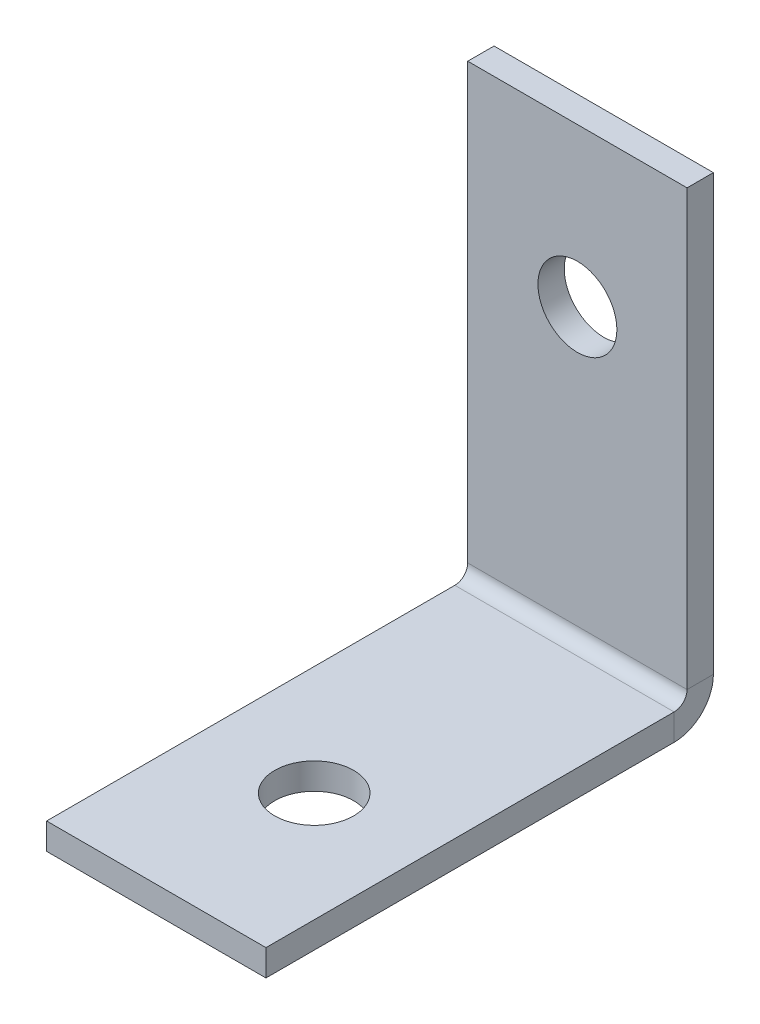
ISO-10303-21;
HEADER;
FILE_DESCRIPTION(('STEP AP214'),'2;1');
FILE_NAME('part.step','',(''),(''),'','','');
FILE_SCHEMA(('AUTOMOTIVE_DESIGN { 1 0 10303 214 1 1 1 1 }'));
ENDSEC;
DATA;
#1=APPLICATION_CONTEXT('core data for automotive mechanical design processes');
#2=APPLICATION_PROTOCOL_DEFINITION('international standard','automotive_design',2000,#1);
#3=PRODUCT_CONTEXT('',#1,'mechanical');
#4=PRODUCT('Part','Part','',(#3));
#5=PRODUCT_RELATED_PRODUCT_CATEGORY('part','',(#4));
#6=PRODUCT_DEFINITION_FORMATION('','',#4);
#7=PRODUCT_DEFINITION_CONTEXT('part definition',#1,'design');
#8=PRODUCT_DEFINITION('design','',#6,#7);
#9=PRODUCT_DEFINITION_SHAPE('','',#8);
#10=(LENGTH_UNIT() NAMED_UNIT(*) SI_UNIT(.MILLI.,.METRE.));
#11=(NAMED_UNIT(*) PLANE_ANGLE_UNIT() SI_UNIT($,.RADIAN.));
#12=(NAMED_UNIT(*) SI_UNIT($,.STERADIAN.) SOLID_ANGLE_UNIT());
#13=UNCERTAINTY_MEASURE_WITH_UNIT(LENGTH_MEASURE(1.E-05),#10,'distance_accuracy_value','');
#14=(GEOMETRIC_REPRESENTATION_CONTEXT(3) GLOBAL_UNCERTAINTY_ASSIGNED_CONTEXT((#13)) GLOBAL_UNIT_ASSIGNED_CONTEXT((#10,
#11,#12)) REPRESENTATION_CONTEXT('',''));
#15=CARTESIAN_POINT('',(0.,0.,0.));
#16=DIRECTION('',(0.,0.,1.));
#17=DIRECTION('',(1.,0.,0.));
#18=AXIS2_PLACEMENT_3D('',#15,#16,#17);
#19=CARTESIAN_POINT('',(6.25,1.5,-12.75));
#20=DIRECTION('',(-1.,0.,0.));
#21=DIRECTION('',(0.,0.,1.));
#22=AXIS2_PLACEMENT_3D('',#19,#20,#21);
#23=PLANE('',#22);
#24=DIRECTION('',(0.,-1.,0.));
#25=VECTOR('',#24,1.);
#26=CARTESIAN_POINT('',(6.25,1.49999999999999,-10.5134));
#27=LINE('',#26,#25);
#28=CARTESIAN_POINT('',(6.25,1.5,-10.5134));
#29=VERTEX_POINT('',#28);
#30=CARTESIAN_POINT('',(6.25,0.,-10.5134));
#31=VERTEX_POINT('',#30);
#32=EDGE_CURVE('E76',#29,#31,#27,.T.);
#33=ORIENTED_EDGE('',*,*,#32,.F.);
#34=DIRECTION('',(0.,0.,-1.));
#35=VECTOR('',#34,1.);
#36=CARTESIAN_POINT('',(6.25,1.5,-12.75));
#37=LINE('',#36,#35);
#38=CARTESIAN_POINT('',(6.25,1.5,12.75));
#39=VERTEX_POINT('',#38);
#40=EDGE_CURVE('E181',#39,#29,#37,.T.);
#41=ORIENTED_EDGE('',*,*,#40,.F.);
#42=DIRECTION('',(0.,-1.,0.));
#43=VECTOR('',#42,1.);
#44=CARTESIAN_POINT('',(6.25,1.5,12.75));
#45=LINE('',#44,#43);
#46=CARTESIAN_POINT('',(6.25,0.,12.75));
#47=VERTEX_POINT('',#46);
#48=EDGE_CURVE('E61',#39,#47,#45,.T.);
#49=ORIENTED_EDGE('',*,*,#48,.T.);
#50=DIRECTION('',(0.,0.,-1.));
#51=VECTOR('',#50,1.);
#52=CARTESIAN_POINT('',(6.25,0.,-12.75));
#53=LINE('',#52,#51);
#54=EDGE_CURVE('E179',#47,#31,#53,.T.);
#55=ORIENTED_EDGE('',*,*,#54,.T.);
#56=EDGE_LOOP('',(#33,#41,#49,#55));
#57=FACE_BOUND('',#56,.T.);
#58=ADVANCED_FACE('F53',(#57),#23,.F.);
#59=CARTESIAN_POINT('',(-6.25,1.5,-12.75));
#60=DIRECTION('',(1.,0.,0.));
#61=DIRECTION('',(0.,0.,-1.));
#62=AXIS2_PLACEMENT_3D('',#59,#60,#61);
#63=PLANE('',#62);
#64=DIRECTION('',(0.,-1.,0.));
#65=VECTOR('',#64,1.);
#66=CARTESIAN_POINT('',(-6.25,1.49999999999999,-10.5134));
#67=LINE('',#66,#65);
#68=CARTESIAN_POINT('',(-6.25,1.5,-10.5134));
#69=VERTEX_POINT('',#68);
#70=CARTESIAN_POINT('',(-6.25,0.,-10.5134));
#71=VERTEX_POINT('',#70);
#72=EDGE_CURVE('E168',#69,#71,#67,.T.);
#73=ORIENTED_EDGE('',*,*,#72,.T.);
#74=DIRECTION('',(0.,0.,1.));
#75=VECTOR('',#74,1.);
#76=CARTESIAN_POINT('',(-6.25,0.,-12.75));
#77=LINE('',#76,#75);
#78=CARTESIAN_POINT('',(-6.25,0.,12.75));
#79=VERTEX_POINT('',#78);
#80=EDGE_CURVE('E189',#71,#79,#77,.T.);
#81=ORIENTED_EDGE('',*,*,#80,.T.);
#82=DIRECTION('',(0.,-1.,0.));
#83=VECTOR('',#82,1.);
#84=CARTESIAN_POINT('',(-6.25,1.5,12.75));
#85=LINE('',#84,#83);
#86=CARTESIAN_POINT('',(-6.25,1.5,12.75));
#87=VERTEX_POINT('',#86);
#88=EDGE_CURVE('E13',#87,#79,#85,.T.);
#89=ORIENTED_EDGE('',*,*,#88,.F.);
#90=DIRECTION('',(0.,0.,1.));
#91=VECTOR('',#90,1.);
#92=CARTESIAN_POINT('',(-6.25,1.5,-12.75));
#93=LINE('',#92,#91);
#94=EDGE_CURVE('E183',#69,#87,#93,.T.);
#95=ORIENTED_EDGE('',*,*,#94,.F.);
#96=EDGE_LOOP('',(#73,#81,#89,#95));
#97=FACE_BOUND('',#96,.T.);
#98=ADVANCED_FACE('F250',(#97),#63,.F.);
#99=CARTESIAN_POINT('',(6.25,1.5,12.75));
#100=DIRECTION('',(0.,1.,0.));
#101=DIRECTION('',(0.,0.,1.));
#102=AXIS2_PLACEMENT_3D('',#99,#100,#101);
#103=PLANE('',#102);
#104=CARTESIAN_POINT('',(0.,1.5,3.75));
#105=DIRECTION('',(0.,1.,0.));
#106=DIRECTION('',(0.,0.,1.));
#107=AXIS2_PLACEMENT_3D('',#104,#105,#106);
#108=CIRCLE('',#107,2.25);
#109=CARTESIAN_POINT('',(0.,1.5,6.));
#110=VERTEX_POINT('',#109);
#111=EDGE_CURVE('E214',#110,#110,#108,.T.);
#112=ORIENTED_EDGE('',*,*,#111,.F.);
#113=EDGE_LOOP('',(#112));
#114=FACE_BOUND('',#113,.T.);
#115=ORIENTED_EDGE('',*,*,#40,.T.);
#116=DIRECTION('',(-1.,0.,0.));
#117=VECTOR('',#116,1.);
#118=CARTESIAN_POINT('',(-6.25,1.49999999999999,-10.5134));
#119=LINE('',#118,#117);
#120=EDGE_CURVE('E68',#69,#29,#119,.F.);
#121=ORIENTED_EDGE('',*,*,#120,.F.);
#122=ORIENTED_EDGE('',*,*,#94,.T.);
#123=DIRECTION('',(1.,0.,0.));
#124=VECTOR('',#123,1.);
#125=CARTESIAN_POINT('',(-6.25,1.5,12.75));
#126=LINE('',#125,#124);
#127=EDGE_CURVE('E186',#87,#39,#126,.T.);
#128=ORIENTED_EDGE('',*,*,#127,.T.);
#129=EDGE_LOOP('',(#115,#121,#122,#128));
#130=FACE_BOUND('',#129,.T.);
#131=ADVANCED_FACE('F254',(#114,#130),#103,.T.);
#132=CARTESIAN_POINT('',(6.25,0.,12.75));
#133=DIRECTION('',(0.,1.,0.));
#134=DIRECTION('',(0.,0.,1.));
#135=AXIS2_PLACEMENT_3D('',#132,#133,#134);
#136=PLANE('',#135);
#137=CARTESIAN_POINT('',(0.,0.,3.75));
#138=DIRECTION('',(0.,1.,0.));
#139=DIRECTION('',(0.,0.,1.));
#140=AXIS2_PLACEMENT_3D('',#137,#138,#139);
#141=CIRCLE('',#140,2.25);
#142=CARTESIAN_POINT('',(0.,0.,6.));
#143=VERTEX_POINT('',#142);
#144=EDGE_CURVE('E56',#143,#143,#141,.T.);
#145=ORIENTED_EDGE('',*,*,#144,.T.);
#146=EDGE_LOOP('',(#145));
#147=FACE_BOUND('',#146,.T.);
#148=DIRECTION('',(-1.,0.,0.));
#149=VECTOR('',#148,1.);
#150=CARTESIAN_POINT('',(-6.25,0.,-10.5134));
#151=LINE('',#150,#149);
#152=EDGE_CURVE('E162',#71,#31,#151,.F.);
#153=ORIENTED_EDGE('',*,*,#152,.T.);
#154=ORIENTED_EDGE('',*,*,#54,.F.);
#155=DIRECTION('',(1.,0.,0.));
#156=VECTOR('',#155,1.);
#157=CARTESIAN_POINT('',(-6.25,0.,12.75));
#158=LINE('',#157,#156);
#159=EDGE_CURVE('E184',#79,#47,#158,.T.);
#160=ORIENTED_EDGE('',*,*,#159,.F.);
#161=ORIENTED_EDGE('',*,*,#80,.F.);
#162=EDGE_LOOP('',(#153,#154,#160,#161));
#163=FACE_BOUND('',#162,.T.);
#164=ADVANCED_FACE('F199',(#147,#163),#136,.F.);
#165=CARTESIAN_POINT('',(-6.25,1.5,12.75));
#166=DIRECTION('',(0.,0.,-1.));
#167=DIRECTION('',(-1.,0.,0.));
#168=AXIS2_PLACEMENT_3D('',#165,#166,#167);
#169=PLANE('',#168);
#170=ORIENTED_EDGE('',*,*,#159,.T.);
#171=ORIENTED_EDGE('',*,*,#48,.F.);
#172=ORIENTED_EDGE('',*,*,#127,.F.);
#173=ORIENTED_EDGE('',*,*,#88,.T.);
#174=EDGE_LOOP('',(#170,#171,#172,#173));
#175=FACE_BOUND('',#174,.T.);
#176=ADVANCED_FACE('F238',(#175),#169,.F.);
#177=CARTESIAN_POINT('',(6.25,2.23659999999999,-10.5134));
#178=DIRECTION('',(1.,0.,0.));
#179=DIRECTION('',(0.,0.,-1.));
#180=AXIS2_PLACEMENT_3D('',#177,#178,#179);
#181=PLANE('',#180);
#182=DIRECTION('',(0.,0.,1.));
#183=VECTOR('',#182,1.);
#184=CARTESIAN_POINT('',(6.25,2.23660000000001,-12.75));
#185=LINE('',#184,#183);
#186=CARTESIAN_POINT('',(6.25,2.23659999999999,-11.25));
#187=VERTEX_POINT('',#186);
#188=CARTESIAN_POINT('',(6.25,2.23659999999998,-12.75));
#189=VERTEX_POINT('',#188);
#190=EDGE_CURVE('E144',#187,#189,#185,.F.);
#191=ORIENTED_EDGE('',*,*,#190,.F.);
#192=CARTESIAN_POINT('',(6.25,2.23659999999999,-10.5134));
#193=DIRECTION('',(-1.,0.,0.));
#194=DIRECTION('',(0.,0.,1.));
#195=AXIS2_PLACEMENT_3D('',#192,#193,#194);
#196=CIRCLE('',#195,0.7366);
#197=EDGE_CURVE('E171',#29,#187,#196,.F.);
#198=ORIENTED_EDGE('',*,*,#197,.F.);
#199=ORIENTED_EDGE('',*,*,#32,.T.);
#200=CARTESIAN_POINT('',(6.25,2.23659999999999,-10.5134));
#201=DIRECTION('',(-1.,0.,0.));
#202=DIRECTION('',(0.,0.,1.));
#203=AXIS2_PLACEMENT_3D('',#200,#201,#202);
#204=CIRCLE('',#203,2.2366);
#205=EDGE_CURVE('E164',#31,#189,#204,.F.);
#206=ORIENTED_EDGE('',*,*,#205,.T.);
#207=EDGE_LOOP('',(#191,#198,#199,#206));
#208=FACE_BOUND('',#207,.T.);
#209=ADVANCED_FACE('F236',(#208),#181,.T.);
#210=CARTESIAN_POINT('',(-6.25,2.23659999999999,-10.5134));
#211=DIRECTION('',(1.,0.,0.));
#212=DIRECTION('',(0.,0.,-1.));
#213=AXIS2_PLACEMENT_3D('',#210,#211,#212);
#214=PLANE('',#213);
#215=CARTESIAN_POINT('',(-6.25,2.23659999999999,-10.5134));
#216=DIRECTION('',(-1.,0.,0.));
#217=DIRECTION('',(0.,0.,1.));
#218=AXIS2_PLACEMENT_3D('',#215,#216,#217);
#219=CIRCLE('',#218,0.7366);
#220=CARTESIAN_POINT('',(-6.25,2.23659999999999,-11.25));
#221=VERTEX_POINT('',#220);
#222=EDGE_CURVE('E175',#221,#69,#219,.T.);
#223=ORIENTED_EDGE('',*,*,#222,.F.);
#224=DIRECTION('',(0.,0.,1.));
#225=VECTOR('',#224,1.);
#226=CARTESIAN_POINT('',(-6.25,2.2366,-11.25));
#227=LINE('',#226,#225);
#228=CARTESIAN_POINT('',(-6.25,2.23660000000001,-12.75));
#229=VERTEX_POINT('',#228);
#230=EDGE_CURVE('E156',#221,#229,#227,.F.);
#231=ORIENTED_EDGE('',*,*,#230,.T.);
#232=CARTESIAN_POINT('',(-6.25,2.23659999999999,-10.5134));
#233=DIRECTION('',(-1.,0.,0.));
#234=DIRECTION('',(0.,0.,1.));
#235=AXIS2_PLACEMENT_3D('',#232,#233,#234);
#236=CIRCLE('',#235,2.2366);
#237=EDGE_CURVE('E165',#229,#71,#236,.T.);
#238=ORIENTED_EDGE('',*,*,#237,.T.);
#239=ORIENTED_EDGE('',*,*,#72,.F.);
#240=EDGE_LOOP('',(#223,#231,#238,#239));
#241=FACE_BOUND('',#240,.T.);
#242=ADVANCED_FACE('F208',(#241),#214,.F.);
#243=CARTESIAN_POINT('',(-6.25,2.23659999999999,-10.5134));
#244=DIRECTION('',(-1.,0.,0.));
#245=DIRECTION('',(0.,0.,-1.));
#246=AXIS2_PLACEMENT_3D('',#243,#244,#245);
#247=CYLINDRICAL_SURFACE('',#246,2.2366);
#248=ORIENTED_EDGE('',*,*,#152,.F.);
#249=ORIENTED_EDGE('',*,*,#237,.F.);
#250=DIRECTION('',(-1.,0.,0.));
#251=VECTOR('',#250,1.);
#252=CARTESIAN_POINT('',(6.25,2.23660000000001,-12.75));
#253=LINE('',#252,#251);
#254=EDGE_CURVE('E154',#229,#189,#253,.F.);
#255=ORIENTED_EDGE('',*,*,#254,.T.);
#256=ORIENTED_EDGE('',*,*,#205,.F.);
#257=EDGE_LOOP('',(#248,#249,#255,#256));
#258=FACE_BOUND('',#257,.T.);
#259=ADVANCED_FACE('F204',(#258),#247,.T.);
#260=CARTESIAN_POINT('',(-6.25,2.23659999999999,-10.5134));
#261=DIRECTION('',(-1.,0.,0.));
#262=DIRECTION('',(0.,0.,-1.));
#263=AXIS2_PLACEMENT_3D('',#260,#261,#262);
#264=CYLINDRICAL_SURFACE('',#263,0.7366);
#265=ORIENTED_EDGE('',*,*,#120,.T.);
#266=ORIENTED_EDGE('',*,*,#197,.T.);
#267=DIRECTION('',(-1.,0.,0.));
#268=VECTOR('',#267,1.);
#269=CARTESIAN_POINT('',(6.25,2.2366,-11.25));
#270=LINE('',#269,#268);
#271=EDGE_CURVE('E159',#187,#221,#270,.T.);
#272=ORIENTED_EDGE('',*,*,#271,.T.);
#273=ORIENTED_EDGE('',*,*,#222,.T.);
#274=EDGE_LOOP('',(#265,#266,#272,#273));
#275=FACE_BOUND('',#274,.T.);
#276=ADVANCED_FACE('F233',(#275),#264,.F.);
#277=CARTESIAN_POINT('',(-6.25,27.,-12.7500000000001));
#278=DIRECTION('',(1.,0.,0.));
#279=DIRECTION('',(0.,0.,-1.));
#280=AXIS2_PLACEMENT_3D('',#277,#278,#279);
#281=PLANE('',#280);
#282=ORIENTED_EDGE('',*,*,#230,.F.);
#283=DIRECTION('',(0.,-1.,0.));
#284=VECTOR('',#283,1.);
#285=CARTESIAN_POINT('',(-6.25,27.,-11.2500000000001));
#286=LINE('',#285,#284);
#287=CARTESIAN_POINT('',(-6.25,27.,-11.2500000000001));
#288=VERTEX_POINT('',#287);
#289=EDGE_CURVE('E152',#221,#288,#286,.F.);
#290=ORIENTED_EDGE('',*,*,#289,.T.);
#291=DIRECTION('',(0.,0.,1.));
#292=VECTOR('',#291,1.);
#293=CARTESIAN_POINT('',(-6.25,27.,-12.7500000000001));
#294=LINE('',#293,#292);
#295=CARTESIAN_POINT('',(-6.25,27.,-12.7500000000001));
#296=VERTEX_POINT('',#295);
#297=EDGE_CURVE('E140',#296,#288,#294,.T.);
#298=ORIENTED_EDGE('',*,*,#297,.F.);
#299=DIRECTION('',(0.,1.,0.));
#300=VECTOR('',#299,1.);
#301=CARTESIAN_POINT('',(-6.25,1.5,-12.75));
#302=LINE('',#301,#300);
#303=EDGE_CURVE('E127',#229,#296,#302,.T.);
#304=ORIENTED_EDGE('',*,*,#303,.F.);
#305=EDGE_LOOP('',(#282,#290,#298,#304));
#306=FACE_BOUND('',#305,.T.);
#307=ADVANCED_FACE('F212',(#306),#281,.F.);
#308=CARTESIAN_POINT('',(6.25,1.49999999999999,-12.75));
#309=DIRECTION('',(-1.,0.,0.));
#310=DIRECTION('',(0.,0.,1.));
#311=AXIS2_PLACEMENT_3D('',#308,#309,#310);
#312=PLANE('',#311);
#313=ORIENTED_EDGE('',*,*,#190,.T.);
#314=DIRECTION('',(0.,-1.,0.));
#315=VECTOR('',#314,1.);
#316=CARTESIAN_POINT('',(6.25,1.5,-12.75));
#317=LINE('',#316,#315);
#318=CARTESIAN_POINT('',(6.25,27.,-12.7500000000001));
#319=VERTEX_POINT('',#318);
#320=EDGE_CURVE('E125',#319,#189,#317,.T.);
#321=ORIENTED_EDGE('',*,*,#320,.F.);
#322=DIRECTION('',(0.,0.,1.));
#323=VECTOR('',#322,1.);
#324=CARTESIAN_POINT('',(6.25,27.,-12.7500000000001));
#325=LINE('',#324,#323);
#326=CARTESIAN_POINT('',(6.25,27.,-11.2500000000001));
#327=VERTEX_POINT('',#326);
#328=EDGE_CURVE('E133',#319,#327,#325,.T.);
#329=ORIENTED_EDGE('',*,*,#328,.T.);
#330=DIRECTION('',(0.,1.,0.));
#331=VECTOR('',#330,1.);
#332=CARTESIAN_POINT('',(6.25,1.5,-11.25));
#333=LINE('',#332,#331);
#334=EDGE_CURVE('E149',#327,#187,#333,.F.);
#335=ORIENTED_EDGE('',*,*,#334,.T.);
#336=EDGE_LOOP('',(#313,#321,#329,#335));
#337=FACE_BOUND('',#336,.T.);
#338=ADVANCED_FACE('F143',(#337),#312,.F.);
#339=CARTESIAN_POINT('',(-6.25,1.5,-12.75));
#340=DIRECTION('',(0.,0.,1.));
#341=DIRECTION('',(0.,-1.,0.));
#342=AXIS2_PLACEMENT_3D('',#339,#340,#341);
#343=PLANE('',#342);
#344=CARTESIAN_POINT('',(0.,18.,-12.7500000000001));
#345=DIRECTION('',(0.,0.,1.));
#346=DIRECTION('',(0.,-1.,0.));
#347=AXIS2_PLACEMENT_3D('',#344,#345,#346);
#348=CIRCLE('',#347,2.25);
#349=CARTESIAN_POINT('',(0.,15.75,-12.75));
#350=VERTEX_POINT('',#349);
#351=EDGE_CURVE('E217',#350,#350,#348,.T.);
#352=ORIENTED_EDGE('',*,*,#351,.T.);
#353=EDGE_LOOP('',(#352));
#354=FACE_BOUND('',#353,.T.);
#355=ORIENTED_EDGE('',*,*,#254,.F.);
#356=ORIENTED_EDGE('',*,*,#303,.T.);
#357=DIRECTION('',(1.,0.,0.));
#358=VECTOR('',#357,1.);
#359=CARTESIAN_POINT('',(-6.25,27.,-12.7500000000001));
#360=LINE('',#359,#358);
#361=EDGE_CURVE('E120',#296,#319,#360,.T.);
#362=ORIENTED_EDGE('',*,*,#361,.T.);
#363=ORIENTED_EDGE('',*,*,#320,.T.);
#364=EDGE_LOOP('',(#355,#356,#362,#363));
#365=FACE_BOUND('',#364,.T.);
#366=ADVANCED_FACE('F123',(#354,#365),#343,.F.);
#367=CARTESIAN_POINT('',(-6.25,1.5,-11.25));
#368=DIRECTION('',(0.,0.,1.));
#369=DIRECTION('',(0.,-1.,0.));
#370=AXIS2_PLACEMENT_3D('',#367,#368,#369);
#371=PLANE('',#370);
#372=CARTESIAN_POINT('',(0.,18.,-11.25));
#373=DIRECTION('',(0.,0.,1.));
#374=DIRECTION('',(1.,0.,0.));
#375=AXIS2_PLACEMENT_3D('',#372,#373,#374);
#376=CIRCLE('',#375,2.25);
#377=CARTESIAN_POINT('',(2.25,18.,-11.25));
#378=VERTEX_POINT('',#377);
#379=EDGE_CURVE('E220',#378,#378,#376,.T.);
#380=ORIENTED_EDGE('',*,*,#379,.F.);
#381=EDGE_LOOP('',(#380));
#382=FACE_BOUND('',#381,.T.);
#383=ORIENTED_EDGE('',*,*,#289,.F.);
#384=ORIENTED_EDGE('',*,*,#271,.F.);
#385=ORIENTED_EDGE('',*,*,#334,.F.);
#386=DIRECTION('',(-1.,0.,0.));
#387=VECTOR('',#386,1.);
#388=CARTESIAN_POINT('',(6.25,27.,-11.2500000000001));
#389=LINE('',#388,#387);
#390=EDGE_CURVE('E136',#288,#327,#389,.F.);
#391=ORIENTED_EDGE('',*,*,#390,.F.);
#392=EDGE_LOOP('',(#383,#384,#385,#391));
#393=FACE_BOUND('',#392,.T.);
#394=ADVANCED_FACE('F227',(#382,#393),#371,.T.);
#395=CARTESIAN_POINT('',(6.25,27.,-12.7500000000001));
#396=DIRECTION('',(0.,-1.,0.));
#397=DIRECTION('',(0.,0.,-1.));
#398=AXIS2_PLACEMENT_3D('',#395,#396,#397);
#399=PLANE('',#398);
#400=ORIENTED_EDGE('',*,*,#390,.T.);
#401=ORIENTED_EDGE('',*,*,#328,.F.);
#402=ORIENTED_EDGE('',*,*,#361,.F.);
#403=ORIENTED_EDGE('',*,*,#297,.T.);
#404=EDGE_LOOP('',(#400,#401,#402,#403));
#405=FACE_BOUND('',#404,.T.);
#406=ADVANCED_FACE('F134',(#405),#399,.F.);
#407=CARTESIAN_POINT('',(0.,-8.5,3.75));
#408=DIRECTION('',(0.,1.,0.));
#409=DIRECTION('',(0.,0.,1.));
#410=AXIS2_PLACEMENT_3D('',#407,#408,#409);
#411=CYLINDRICAL_SURFACE('',#410,2.25);
#412=ORIENTED_EDGE('',*,*,#111,.T.);
#413=EDGE_LOOP('',(#412));
#414=FACE_BOUND('',#413,.T.);
#415=ORIENTED_EDGE('',*,*,#144,.F.);
#416=EDGE_LOOP('',(#415));
#417=FACE_BOUND('',#416,.T.);
#418=ADVANCED_FACE('F269',(#414,#417),#411,.F.);
#419=CARTESIAN_POINT('',(0.,18.,-21.25));
#420=DIRECTION('',(0.,0.,1.));
#421=DIRECTION('',(1.,0.,0.));
#422=AXIS2_PLACEMENT_3D('',#419,#420,#421);
#423=CYLINDRICAL_SURFACE('',#422,2.25);
#424=ORIENTED_EDGE('',*,*,#379,.T.);
#425=EDGE_LOOP('',(#424));
#426=FACE_BOUND('',#425,.T.);
#427=ORIENTED_EDGE('',*,*,#351,.F.);
#428=EDGE_LOOP('',(#427));
#429=FACE_BOUND('',#428,.T.);
#430=ADVANCED_FACE('F224',(#426,#429),#423,.F.);
#431=CLOSED_SHELL('',(#58,#98,#131,#164,#176,#209,#242,#259,#276,#307,#338,#366,#394,#406,#418,#430));
#432=MANIFOLD_SOLID_BREP('B2',#431);
#433=ADVANCED_BREP_SHAPE_REPRESENTATION('',(#18,#432),#14);
#434=SHAPE_DEFINITION_REPRESENTATION(#9,#433);
ENDSEC;
END-ISO-10303-21;
